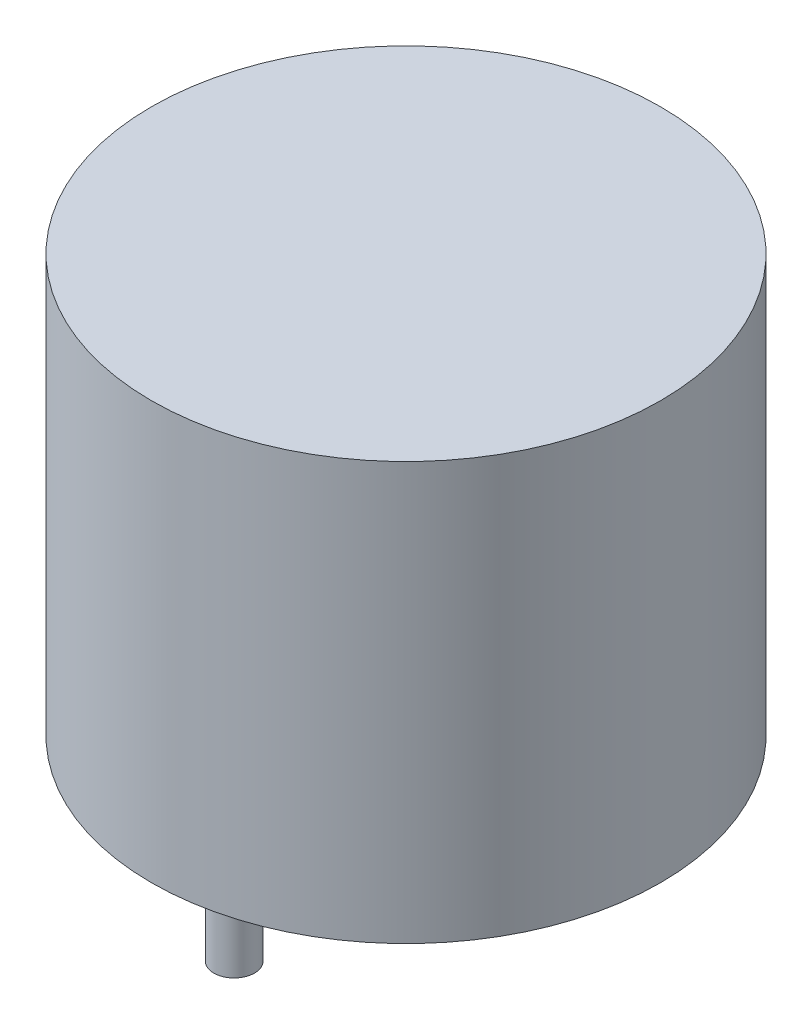
ISO-10303-21;
HEADER;
FILE_DESCRIPTION(('STEP AP214'),'2;1');
FILE_NAME('part.step','',(''),(''),'','','');
FILE_SCHEMA(('AUTOMOTIVE_DESIGN { 1 0 10303 214 1 1 1 1 }'));
ENDSEC;
DATA;
#1=APPLICATION_CONTEXT('core data for automotive mechanical design processes');
#2=APPLICATION_PROTOCOL_DEFINITION('international standard','automotive_design',2000,#1);
#3=PRODUCT_CONTEXT('',#1,'mechanical');
#4=PRODUCT('Part','Part','',(#3));
#5=PRODUCT_RELATED_PRODUCT_CATEGORY('part','',(#4));
#6=PRODUCT_DEFINITION_FORMATION('','',#4);
#7=PRODUCT_DEFINITION_CONTEXT('part definition',#1,'design');
#8=PRODUCT_DEFINITION('design','',#6,#7);
#9=PRODUCT_DEFINITION_SHAPE('','',#8);
#10=(LENGTH_UNIT() NAMED_UNIT(*) SI_UNIT(.MILLI.,.METRE.));
#11=(NAMED_UNIT(*) PLANE_ANGLE_UNIT() SI_UNIT($,.RADIAN.));
#12=(NAMED_UNIT(*) SI_UNIT($,.STERADIAN.) SOLID_ANGLE_UNIT());
#13=UNCERTAINTY_MEASURE_WITH_UNIT(LENGTH_MEASURE(1.E-05),#10,'distance_accuracy_value','');
#14=(GEOMETRIC_REPRESENTATION_CONTEXT(3) GLOBAL_UNCERTAINTY_ASSIGNED_CONTEXT((#13)) GLOBAL_UNIT_ASSIGNED_CONTEXT((#10,
#11,#12)) REPRESENTATION_CONTEXT('',''));
#15=CARTESIAN_POINT('',(0.,0.,0.));
#16=DIRECTION('',(0.,0.,1.));
#17=DIRECTION('',(1.,0.,0.));
#18=AXIS2_PLACEMENT_3D('',#15,#16,#17);
#19=CARTESIAN_POINT('',(0.,16.4,0.));
#20=DIRECTION('',(0.,-1.,0.));
#21=DIRECTION('',(0.,0.,-1.));
#22=AXIS2_PLACEMENT_3D('',#19,#20,#21);
#23=CYLINDRICAL_SURFACE('',#22,10.);
#24=CARTESIAN_POINT('',(0.,16.4,0.));
#25=DIRECTION('',(0.,1.,0.));
#26=DIRECTION('',(0.,0.,1.));
#27=AXIS2_PLACEMENT_3D('',#24,#25,#26);
#28=CIRCLE('',#27,10.);
#29=CARTESIAN_POINT('',(0.,16.4,10.));
#30=VERTEX_POINT('',#29);
#31=EDGE_CURVE('E41',#30,#30,#28,.T.);
#32=ORIENTED_EDGE('',*,*,#31,.F.);
#33=EDGE_LOOP('',(#32));
#34=FACE_BOUND('',#33,.T.);
#35=CARTESIAN_POINT('',(0.,0.,0.));
#36=DIRECTION('',(0.,1.,0.));
#37=DIRECTION('',(0.,0.,1.));
#38=AXIS2_PLACEMENT_3D('',#35,#36,#37);
#39=CIRCLE('',#38,10.);
#40=CARTESIAN_POINT('',(0.,0.,10.));
#41=VERTEX_POINT('',#40);
#42=EDGE_CURVE('E45',#41,#41,#39,.T.);
#43=ORIENTED_EDGE('',*,*,#42,.T.);
#44=EDGE_LOOP('',(#43));
#45=FACE_BOUND('',#44,.T.);
#46=ADVANCED_FACE('F31',(#34,#45),#23,.T.);
#47=CARTESIAN_POINT('',(0.,16.4,0.));
#48=DIRECTION('',(0.,1.,0.));
#49=DIRECTION('',(0.,0.,1.));
#50=AXIS2_PLACEMENT_3D('',#47,#48,#49);
#51=PLANE('',#50);
#52=ORIENTED_EDGE('',*,*,#31,.T.);
#53=EDGE_LOOP('',(#52));
#54=FACE_BOUND('',#53,.T.);
#55=ADVANCED_FACE('F72',(#54),#51,.T.);
#56=CARTESIAN_POINT('',(0.,0.,0.));
#57=DIRECTION('',(0.,1.,0.));
#58=DIRECTION('',(0.,0.,1.));
#59=AXIS2_PLACEMENT_3D('',#56,#57,#58);
#60=PLANE('',#59);
#61=CARTESIAN_POINT('',(-6.75,0.,0.));
#62=DIRECTION('',(0.,1.,0.));
#63=DIRECTION('',(0.,0.,1.));
#64=AXIS2_PLACEMENT_3D('',#61,#62,#63);
#65=CIRCLE('',#64,0.8);
#66=CARTESIAN_POINT('',(-6.75,0.,0.799999999999999));
#67=VERTEX_POINT('',#66);
#68=EDGE_CURVE('E10',#67,#67,#65,.F.);
#69=ORIENTED_EDGE('',*,*,#68,.F.);
#70=EDGE_LOOP('',(#69));
#71=FACE_BOUND('',#70,.T.);
#72=CARTESIAN_POINT('',(0.,0.,6.75));
#73=DIRECTION('',(0.,1.,0.));
#74=DIRECTION('',(0.,0.,1.));
#75=AXIS2_PLACEMENT_3D('',#72,#73,#74);
#76=CIRCLE('',#75,0.8);
#77=CARTESIAN_POINT('',(0.,0.,7.55));
#78=VERTEX_POINT('',#77);
#79=EDGE_CURVE('E37',#78,#78,#76,.F.);
#80=ORIENTED_EDGE('',*,*,#79,.F.);
#81=EDGE_LOOP('',(#80));
#82=FACE_BOUND('',#81,.T.);
#83=ORIENTED_EDGE('',*,*,#42,.F.);
#84=EDGE_LOOP('',(#83));
#85=FACE_BOUND('',#84,.T.);
#86=ADVANCED_FACE('F77',(#71,#82,#85),#60,.F.);
#87=CARTESIAN_POINT('',(0.,-4.3,6.75));
#88=DIRECTION('',(0.,1.,0.));
#89=DIRECTION('',(0.,0.,1.));
#90=AXIS2_PLACEMENT_3D('',#87,#88,#89);
#91=CYLINDRICAL_SURFACE('',#90,0.8);
#92=CARTESIAN_POINT('',(0.,-4.3,6.75));
#93=DIRECTION('',(0.,-1.,0.));
#94=DIRECTION('',(0.,0.,-1.));
#95=AXIS2_PLACEMENT_3D('',#92,#93,#94);
#96=CIRCLE('',#95,0.8);
#97=CARTESIAN_POINT('',(0.,-4.3,7.55));
#98=VERTEX_POINT('',#97);
#99=EDGE_CURVE('E49',#98,#98,#96,.T.);
#100=CARTESIAN_POINT('',(0.,-4.3,7.55));
#101=CARTESIAN_POINT('',(0.,-4.25520833333333,7.55));
#102=CARTESIAN_POINT('',(0.,-4.21041666666667,7.55));
#103=CARTESIAN_POINT('',(0.,-4.12083333333333,7.55));
#104=CARTESIAN_POINT('',(0.,-4.07604166666667,7.55));
#105=CARTESIAN_POINT('',(0.,-3.98645833333333,7.55));
#106=CARTESIAN_POINT('',(0.,-3.94166666666667,7.55));
#107=CARTESIAN_POINT('',(0.,-3.85208333333333,7.55));
#108=CARTESIAN_POINT('',(0.,-3.80729166666667,7.55));
#109=CARTESIAN_POINT('',(0.,-3.71770833333333,7.55));
#110=CARTESIAN_POINT('',(0.,-3.67291666666667,7.55));
#111=CARTESIAN_POINT('',(0.,-3.58333333333333,7.55));
#112=CARTESIAN_POINT('',(0.,-3.53854166666667,7.55));
#113=CARTESIAN_POINT('',(0.,-3.44895833333333,7.55));
#114=CARTESIAN_POINT('',(0.,-3.40416666666667,7.55));
#115=CARTESIAN_POINT('',(0.,-3.31458333333333,7.55));
#116=CARTESIAN_POINT('',(0.,-3.26979166666667,7.55));
#117=CARTESIAN_POINT('',(0.,-3.18020833333333,7.55));
#118=CARTESIAN_POINT('',(0.,-3.13541666666667,7.55));
#119=CARTESIAN_POINT('',(0.,-3.04583333333333,7.55));
#120=CARTESIAN_POINT('',(0.,-3.00104166666667,7.55));
#121=CARTESIAN_POINT('',(0.,-2.91145833333333,7.55));
#122=CARTESIAN_POINT('',(0.,-2.86666666666667,7.55));
#123=CARTESIAN_POINT('',(0.,-2.77708333333333,7.55));
#124=CARTESIAN_POINT('',(0.,-2.73229166666667,7.55));
#125=CARTESIAN_POINT('',(0.,-2.64270833333333,7.55));
#126=CARTESIAN_POINT('',(0.,-2.59791666666667,7.55));
#127=CARTESIAN_POINT('',(0.,-2.50833333333333,7.55));
#128=CARTESIAN_POINT('',(0.,-2.46354166666667,7.55));
#129=CARTESIAN_POINT('',(0.,-2.37395833333333,7.55));
#130=CARTESIAN_POINT('',(0.,-2.32916666666667,7.55));
#131=CARTESIAN_POINT('',(0.,-2.23958333333333,7.55));
#132=CARTESIAN_POINT('',(0.,-2.19479166666667,7.55));
#133=CARTESIAN_POINT('',(0.,-2.10520833333333,7.55));
#134=CARTESIAN_POINT('',(0.,-2.06041666666667,7.55));
#135=CARTESIAN_POINT('',(0.,-1.97083333333333,7.55));
#136=CARTESIAN_POINT('',(0.,-1.92604166666667,7.55));
#137=CARTESIAN_POINT('',(0.,-1.83645833333333,7.55));
#138=CARTESIAN_POINT('',(0.,-1.79166666666667,7.55));
#139=CARTESIAN_POINT('',(0.,-1.70208333333333,7.55));
#140=CARTESIAN_POINT('',(0.,-1.65729166666667,7.55));
#141=CARTESIAN_POINT('',(0.,-1.56770833333333,7.55));
#142=CARTESIAN_POINT('',(0.,-1.52291666666667,7.55));
#143=CARTESIAN_POINT('',(0.,-1.43333333333333,7.55));
#144=CARTESIAN_POINT('',(0.,-1.38854166666667,7.55));
#145=CARTESIAN_POINT('',(0.,-1.29895833333333,7.55));
#146=CARTESIAN_POINT('',(0.,-1.25416666666667,7.55));
#147=CARTESIAN_POINT('',(0.,-1.16458333333333,7.55));
#148=CARTESIAN_POINT('',(0.,-1.11979166666667,7.55));
#149=CARTESIAN_POINT('',(0.,-1.03020833333333,7.55));
#150=CARTESIAN_POINT('',(0.,-0.985416666666667,7.55));
#151=CARTESIAN_POINT('',(0.,-0.895833333333334,7.55));
#152=CARTESIAN_POINT('',(0.,-0.851041666666667,7.55));
#153=CARTESIAN_POINT('',(0.,-0.761458333333334,7.55));
#154=CARTESIAN_POINT('',(0.,-0.716666666666667,7.55));
#155=CARTESIAN_POINT('',(0.,-0.627083333333334,7.55));
#156=CARTESIAN_POINT('',(0.,-0.582291666666667,7.55));
#157=CARTESIAN_POINT('',(0.,-0.492708333333334,7.55));
#158=CARTESIAN_POINT('',(0.,-0.447916666666667,7.55));
#159=CARTESIAN_POINT('',(0.,-0.358333333333334,7.55));
#160=CARTESIAN_POINT('',(0.,-0.313541666666667,7.55));
#161=CARTESIAN_POINT('',(0.,-0.223958333333334,7.55));
#162=CARTESIAN_POINT('',(0.,-0.179166666666667,7.55));
#163=CARTESIAN_POINT('',(0.,-0.0895833333333342,7.55));
#164=CARTESIAN_POINT('',(0.,-0.0447916666666675,7.55));
#165=CARTESIAN_POINT('',(0.,0.,7.55));
#166=B_SPLINE_CURVE_WITH_KNOTS('',3,(#100,#101,#102,#103,#104,#105,#106,#107,#108,#109,#110,
#111,#112,#113,#114,#115,#116,#117,#118,#119,#120,#121,#122,#123,#124,#125,#126,#127,#128,#129,
#130,#131,#132,#133,#134,#135,#136,#137,#138,#139,#140,#141,#142,#143,#144,#145,#146,#147,#148,
#149,#150,#151,#152,#153,#154,#155,#156,#157,#158,#159,#160,#161,#162,#163,#164,#165),
.UNSPECIFIED.,.F.,.F.,(4,2,2,2,2,2,2,2,2,2,2,2,2,2,2,2,2,2,2,2,2,2,2,2,2,2,2,2,2,2,2,2,4),(0.,
0.134375,0.268749999999999,0.403124999999999,0.537499999999999,0.671874999999999,
0.806249999999999,0.940624999999999,1.075,1.209375,1.34375,1.478125,1.6125,1.746875,1.88125,
2.015625,2.15,2.284375,2.41875,2.553125,2.6875,2.821875,2.95625,3.090625,3.225,3.359375,3.49375,
3.628125,3.7625,3.896875,4.03125,4.165625,4.3),.UNSPECIFIED.);
#167=EDGE_CURVE('BSEAM68',#98,#78,#166,.T.);
#168=ORIENTED_EDGE('',*,*,#99,.F.);
#169=ORIENTED_EDGE('',*,*,#79,.T.);
#170=ORIENTED_EDGE('',*,*,#167,.T.);
#171=ORIENTED_EDGE('',*,*,#167,.F.);
#172=EDGE_LOOP('',(#168,#170,#169,#171));
#173=FACE_BOUND('',#172,.T.);
#174=ADVANCED_FACE('F68',(#173),#91,.T.);
#175=CARTESIAN_POINT('',(0.,-4.3,6.75));
#176=DIRECTION('',(0.,-1.,0.));
#177=DIRECTION('',(0.,0.,-1.));
#178=AXIS2_PLACEMENT_3D('',#175,#176,#177);
#179=PLANE('',#178);
#180=ORIENTED_EDGE('',*,*,#99,.T.);
#181=EDGE_LOOP('',(#180));
#182=FACE_BOUND('',#181,.T.);
#183=ADVANCED_FACE('F61',(#182),#179,.T.);
#184=CARTESIAN_POINT('',(-6.75,-4.3,0.));
#185=DIRECTION('',(0.,1.,0.));
#186=DIRECTION('',(0.,0.,1.));
#187=AXIS2_PLACEMENT_3D('',#184,#185,#186);
#188=CYLINDRICAL_SURFACE('',#187,0.8);
#189=CARTESIAN_POINT('',(-6.75,-4.3,0.));
#190=DIRECTION('',(0.,-1.,0.));
#191=DIRECTION('',(0.,0.,-1.));
#192=AXIS2_PLACEMENT_3D('',#189,#190,#191);
#193=CIRCLE('',#192,0.8);
#194=CARTESIAN_POINT('',(-6.75,-4.3,0.799999999999999));
#195=VERTEX_POINT('',#194);
#196=EDGE_CURVE('E53',#195,#195,#193,.T.);
#197=CARTESIAN_POINT('',(-6.75,-4.3,0.799999999999999));
#198=CARTESIAN_POINT('',(-6.75,-4.25520833333333,0.799999999999999));
#199=CARTESIAN_POINT('',(-6.75,-4.21041666666667,0.799999999999999));
#200=CARTESIAN_POINT('',(-6.75,-4.12083333333333,0.799999999999999));
#201=CARTESIAN_POINT('',(-6.75,-4.07604166666667,0.799999999999999));
#202=CARTESIAN_POINT('',(-6.75,-3.98645833333333,0.799999999999999));
#203=CARTESIAN_POINT('',(-6.75,-3.94166666666667,0.799999999999999));
#204=CARTESIAN_POINT('',(-6.75,-3.85208333333333,0.799999999999999));
#205=CARTESIAN_POINT('',(-6.75,-3.80729166666667,0.799999999999999));
#206=CARTESIAN_POINT('',(-6.75,-3.71770833333333,0.799999999999999));
#207=CARTESIAN_POINT('',(-6.75,-3.67291666666667,0.799999999999999));
#208=CARTESIAN_POINT('',(-6.75,-3.58333333333333,0.799999999999999));
#209=CARTESIAN_POINT('',(-6.75,-3.53854166666667,0.799999999999999));
#210=CARTESIAN_POINT('',(-6.75,-3.44895833333333,0.799999999999999));
#211=CARTESIAN_POINT('',(-6.75,-3.40416666666667,0.799999999999999));
#212=CARTESIAN_POINT('',(-6.75,-3.31458333333333,0.799999999999999));
#213=CARTESIAN_POINT('',(-6.75,-3.26979166666667,0.799999999999999));
#214=CARTESIAN_POINT('',(-6.75,-3.18020833333333,0.799999999999999));
#215=CARTESIAN_POINT('',(-6.75,-3.13541666666667,0.799999999999999));
#216=CARTESIAN_POINT('',(-6.75,-3.04583333333333,0.799999999999999));
#217=CARTESIAN_POINT('',(-6.75,-3.00104166666667,0.799999999999999));
#218=CARTESIAN_POINT('',(-6.75,-2.91145833333333,0.799999999999999));
#219=CARTESIAN_POINT('',(-6.75,-2.86666666666667,0.799999999999999));
#220=CARTESIAN_POINT('',(-6.75,-2.77708333333333,0.799999999999999));
#221=CARTESIAN_POINT('',(-6.75,-2.73229166666667,0.799999999999999));
#222=CARTESIAN_POINT('',(-6.75,-2.64270833333333,0.799999999999999));
#223=CARTESIAN_POINT('',(-6.75,-2.59791666666667,0.799999999999999));
#224=CARTESIAN_POINT('',(-6.75,-2.50833333333333,0.799999999999999));
#225=CARTESIAN_POINT('',(-6.75,-2.46354166666667,0.799999999999999));
#226=CARTESIAN_POINT('',(-6.75,-2.37395833333333,0.799999999999999));
#227=CARTESIAN_POINT('',(-6.75,-2.32916666666667,0.799999999999999));
#228=CARTESIAN_POINT('',(-6.75,-2.23958333333333,0.799999999999999));
#229=CARTESIAN_POINT('',(-6.75,-2.19479166666667,0.799999999999999));
#230=CARTESIAN_POINT('',(-6.75,-2.10520833333333,0.799999999999999));
#231=CARTESIAN_POINT('',(-6.75,-2.06041666666667,0.799999999999999));
#232=CARTESIAN_POINT('',(-6.75,-1.97083333333333,0.799999999999999));
#233=CARTESIAN_POINT('',(-6.75,-1.92604166666667,0.799999999999999));
#234=CARTESIAN_POINT('',(-6.75,-1.83645833333333,0.799999999999999));
#235=CARTESIAN_POINT('',(-6.75,-1.79166666666667,0.799999999999999));
#236=CARTESIAN_POINT('',(-6.75,-1.70208333333333,0.799999999999999));
#237=CARTESIAN_POINT('',(-6.75,-1.65729166666667,0.799999999999999));
#238=CARTESIAN_POINT('',(-6.75,-1.56770833333333,0.799999999999999));
#239=CARTESIAN_POINT('',(-6.75,-1.52291666666667,0.799999999999999));
#240=CARTESIAN_POINT('',(-6.75,-1.43333333333333,0.799999999999999));
#241=CARTESIAN_POINT('',(-6.75,-1.38854166666667,0.799999999999999));
#242=CARTESIAN_POINT('',(-6.75,-1.29895833333333,0.799999999999999));
#243=CARTESIAN_POINT('',(-6.75,-1.25416666666667,0.799999999999999));
#244=CARTESIAN_POINT('',(-6.75,-1.16458333333333,0.799999999999999));
#245=CARTESIAN_POINT('',(-6.75,-1.11979166666667,0.799999999999999));
#246=CARTESIAN_POINT('',(-6.75,-1.03020833333333,0.799999999999999));
#247=CARTESIAN_POINT('',(-6.75,-0.985416666666667,0.799999999999999));
#248=CARTESIAN_POINT('',(-6.75,-0.895833333333334,0.799999999999999));
#249=CARTESIAN_POINT('',(-6.75,-0.851041666666667,0.799999999999999));
#250=CARTESIAN_POINT('',(-6.75,-0.761458333333334,0.799999999999999));
#251=CARTESIAN_POINT('',(-6.75,-0.716666666666667,0.799999999999999));
#252=CARTESIAN_POINT('',(-6.75,-0.627083333333334,0.799999999999999));
#253=CARTESIAN_POINT('',(-6.75,-0.582291666666667,0.799999999999999));
#254=CARTESIAN_POINT('',(-6.75,-0.492708333333334,0.799999999999999));
#255=CARTESIAN_POINT('',(-6.75,-0.447916666666667,0.799999999999999));
#256=CARTESIAN_POINT('',(-6.75,-0.358333333333334,0.799999999999999));
#257=CARTESIAN_POINT('',(-6.75,-0.313541666666667,0.799999999999999));
#258=CARTESIAN_POINT('',(-6.75,-0.223958333333334,0.799999999999999));
#259=CARTESIAN_POINT('',(-6.75,-0.179166666666667,0.799999999999999));
#260=CARTESIAN_POINT('',(-6.75,-0.0895833333333342,0.799999999999999));
#261=CARTESIAN_POINT('',(-6.75,-0.0447916666666675,0.799999999999999));
#262=CARTESIAN_POINT('',(-6.75,0.,0.799999999999999));
#263=B_SPLINE_CURVE_WITH_KNOTS('',3,(#197,#198,#199,#200,#201,#202,#203,#204,#205,#206,#207,
#208,#209,#210,#211,#212,#213,#214,#215,#216,#217,#218,#219,#220,#221,#222,#223,#224,#225,#226,
#227,#228,#229,#230,#231,#232,#233,#234,#235,#236,#237,#238,#239,#240,#241,#242,#243,#244,#245,
#246,#247,#248,#249,#250,#251,#252,#253,#254,#255,#256,#257,#258,#259,#260,#261,#262),
.UNSPECIFIED.,.F.,.F.,(4,2,2,2,2,2,2,2,2,2,2,2,2,2,2,2,2,2,2,2,2,2,2,2,2,2,2,2,2,2,2,2,4),(0.,
0.134375,0.268749999999999,0.403124999999999,0.537499999999999,0.671874999999999,
0.806249999999999,0.940624999999999,1.075,1.209375,1.34375,1.478125,1.6125,1.746875,1.88125,
2.015625,2.15,2.284375,2.41875,2.553125,2.6875,2.821875,2.95625,3.090625,3.225,3.359375,3.49375,
3.628125,3.7625,3.896875,4.03125,4.165625,4.3),.UNSPECIFIED.);
#264=EDGE_CURVE('BSEAM59',#195,#67,#263,.T.);
#265=ORIENTED_EDGE('',*,*,#196,.F.);
#266=ORIENTED_EDGE('',*,*,#68,.T.);
#267=ORIENTED_EDGE('',*,*,#264,.T.);
#268=ORIENTED_EDGE('',*,*,#264,.F.);
#269=EDGE_LOOP('',(#265,#267,#266,#268));
#270=FACE_BOUND('',#269,.T.);
#271=ADVANCED_FACE('F59',(#270),#188,.T.);
#272=CARTESIAN_POINT('',(-6.75,-4.3,0.));
#273=DIRECTION('',(0.,-1.,0.));
#274=DIRECTION('',(0.,0.,-1.));
#275=AXIS2_PLACEMENT_3D('',#272,#273,#274);
#276=PLANE('',#275);
#277=ORIENTED_EDGE('',*,*,#196,.T.);
#278=EDGE_LOOP('',(#277));
#279=FACE_BOUND('',#278,.T.);
#280=ADVANCED_FACE('F57',(#279),#276,.T.);
#281=CLOSED_SHELL('',(#46,#55,#86,#174,#183,#271,#280));
#282=MANIFOLD_SOLID_BREP('B2',#281);
#283=ADVANCED_BREP_SHAPE_REPRESENTATION('',(#18,#282),#14);
#284=SHAPE_DEFINITION_REPRESENTATION(#9,#283);
ENDSEC;
END-ISO-10303-21;
